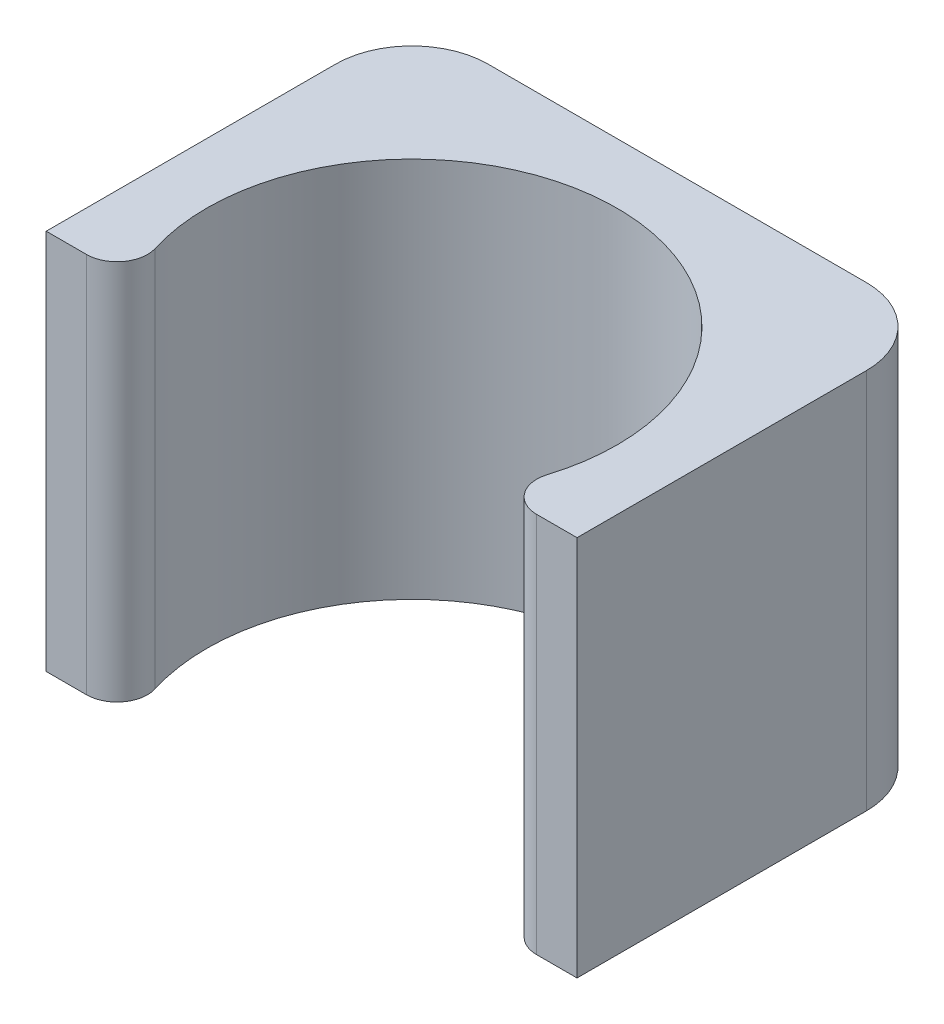
ISO-10303-21;
HEADER;
FILE_DESCRIPTION(('STEP AP214'),'2;1');
FILE_NAME('part.step','',(''),(''),'','','');
FILE_SCHEMA(('AUTOMOTIVE_DESIGN { 1 0 10303 214 1 1 1 1 }'));
ENDSEC;
DATA;
#1=APPLICATION_CONTEXT('core data for automotive mechanical design processes');
#2=APPLICATION_PROTOCOL_DEFINITION('international standard','automotive_design',2000,#1);
#3=PRODUCT_CONTEXT('',#1,'mechanical');
#4=PRODUCT('Part','Part','',(#3));
#5=PRODUCT_RELATED_PRODUCT_CATEGORY('part','',(#4));
#6=PRODUCT_DEFINITION_FORMATION('','',#4);
#7=PRODUCT_DEFINITION_CONTEXT('part definition',#1,'design');
#8=PRODUCT_DEFINITION('design','',#6,#7);
#9=PRODUCT_DEFINITION_SHAPE('','',#8);
#10=(LENGTH_UNIT() NAMED_UNIT(*) SI_UNIT(.MILLI.,.METRE.));
#11=(NAMED_UNIT(*) PLANE_ANGLE_UNIT() SI_UNIT($,.RADIAN.));
#12=(NAMED_UNIT(*) SI_UNIT($,.STERADIAN.) SOLID_ANGLE_UNIT());
#13=UNCERTAINTY_MEASURE_WITH_UNIT(LENGTH_MEASURE(1.E-05),#10,'distance_accuracy_value','');
#14=(GEOMETRIC_REPRESENTATION_CONTEXT(3) GLOBAL_UNCERTAINTY_ASSIGNED_CONTEXT((#13)) GLOBAL_UNIT_ASSIGNED_CONTEXT((#10,
#11,#12)) REPRESENTATION_CONTEXT('',''));
#15=CARTESIAN_POINT('',(0.,0.,0.));
#16=DIRECTION('',(0.,0.,1.));
#17=DIRECTION('',(1.,0.,0.));
#18=AXIS2_PLACEMENT_3D('',#15,#16,#17);
#19=CARTESIAN_POINT('',(-34.8,25.,0.));
#20=DIRECTION('',(0.,0.,1.));
#21=DIRECTION('',(1.,0.,0.));
#22=AXIS2_PLACEMENT_3D('',#19,#20,#21);
#23=PLANE('',#22);
#24=DIRECTION('',(-1.,0.,0.));
#25=VECTOR('',#24,1.);
#26=CARTESIAN_POINT('',(-34.8,25.,0.));
#27=LINE('',#26,#25);
#28=CARTESIAN_POINT('',(-5.,25.,0.));
#29=VERTEX_POINT('',#28);
#30=CARTESIAN_POINT('',(-29.8,25.,0.));
#31=VERTEX_POINT('',#30);
#32=EDGE_CURVE('E118',#29,#31,#27,.T.);
#33=ORIENTED_EDGE('',*,*,#32,.F.);
#34=DIRECTION('',(0.,-1.,0.));
#35=VECTOR('',#34,1.);
#36=CARTESIAN_POINT('',(-5.,25.,0.));
#37=LINE('',#36,#35);
#38=CARTESIAN_POINT('',(-5.,0.,0.));
#39=VERTEX_POINT('',#38);
#40=EDGE_CURVE('E176',#29,#39,#37,.T.);
#41=ORIENTED_EDGE('',*,*,#40,.T.);
#42=DIRECTION('',(-1.,0.,0.));
#43=VECTOR('',#42,1.);
#44=CARTESIAN_POINT('',(-34.8,0.,0.));
#45=LINE('',#44,#43);
#46=CARTESIAN_POINT('',(-29.8,0.,0.));
#47=VERTEX_POINT('',#46);
#48=EDGE_CURVE('E147',#39,#47,#45,.T.);
#49=ORIENTED_EDGE('',*,*,#48,.T.);
#50=DIRECTION('',(0.,-1.,0.));
#51=VECTOR('',#50,1.);
#52=CARTESIAN_POINT('',(-29.8,25.,0.));
#53=LINE('',#52,#51);
#54=EDGE_CURVE('E127',#47,#31,#53,.F.);
#55=ORIENTED_EDGE('',*,*,#54,.T.);
#56=EDGE_LOOP('',(#33,#41,#49,#55));
#57=FACE_BOUND('',#56,.T.);
#58=ADVANCED_FACE('F33',(#57),#23,.F.);
#59=CARTESIAN_POINT('',(-34.8,25.,0.));
#60=DIRECTION('',(1.,0.,0.));
#61=DIRECTION('',(0.,0.,-1.));
#62=AXIS2_PLACEMENT_3D('',#59,#60,#61);
#63=PLANE('',#62);
#64=DIRECTION('',(0.,0.,1.));
#65=VECTOR('',#64,1.);
#66=CARTESIAN_POINT('',(-34.8,25.,0.));
#67=LINE('',#66,#65);
#68=CARTESIAN_POINT('',(-34.8,25.,5.));
#69=VERTEX_POINT('',#68);
#70=CARTESIAN_POINT('',(-34.8,25.,23.97));
#71=VERTEX_POINT('',#70);
#72=EDGE_CURVE('E110',#69,#71,#67,.T.);
#73=ORIENTED_EDGE('',*,*,#72,.F.);
#74=DIRECTION('',(0.,-1.,0.));
#75=VECTOR('',#74,1.);
#76=CARTESIAN_POINT('',(-34.8,25.,5.));
#77=LINE('',#76,#75);
#78=CARTESIAN_POINT('',(-34.8,0.,5.));
#79=VERTEX_POINT('',#78);
#80=EDGE_CURVE('E11',#69,#79,#77,.T.);
#81=ORIENTED_EDGE('',*,*,#80,.T.);
#82=DIRECTION('',(0.,0.,1.));
#83=VECTOR('',#82,1.);
#84=CARTESIAN_POINT('',(-34.8,0.,0.));
#85=LINE('',#84,#83);
#86=CARTESIAN_POINT('',(-34.8,0.,23.97));
#87=VERTEX_POINT('',#86);
#88=EDGE_CURVE('E124',#79,#87,#85,.T.);
#89=ORIENTED_EDGE('',*,*,#88,.T.);
#90=DIRECTION('',(0.,-1.,0.));
#91=VECTOR('',#90,1.);
#92=CARTESIAN_POINT('',(-34.8,25.,23.97));
#93=LINE('',#92,#91);
#94=EDGE_CURVE('E121',#71,#87,#93,.T.);
#95=ORIENTED_EDGE('',*,*,#94,.F.);
#96=EDGE_LOOP('',(#73,#81,#89,#95));
#97=FACE_BOUND('',#96,.T.);
#98=ADVANCED_FACE('F122',(#97),#63,.F.);
#99=CARTESIAN_POINT('',(-34.8,25.,23.97));
#100=DIRECTION('',(0.,0.,-1.));
#101=DIRECTION('',(-1.,0.,0.));
#102=AXIS2_PLACEMENT_3D('',#99,#100,#101);
#103=PLANE('',#102);
#104=DIRECTION('',(1.,0.,0.));
#105=VECTOR('',#104,1.);
#106=CARTESIAN_POINT('',(-34.8,0.,23.97));
#107=LINE('',#106,#105);
#108=CARTESIAN_POINT('',(-32.1586449242469,0.,23.97));
#109=VERTEX_POINT('',#108);
#110=EDGE_CURVE('E151',#87,#109,#107,.T.);
#111=ORIENTED_EDGE('',*,*,#110,.T.);
#112=DIRECTION('',(0.,-1.,0.));
#113=VECTOR('',#112,1.);
#114=CARTESIAN_POINT('',(-32.1586449242469,25.,23.97));
#115=LINE('',#114,#113);
#116=CARTESIAN_POINT('',(-32.1586449242469,25.,23.97));
#117=VERTEX_POINT('',#116);
#118=EDGE_CURVE('E128',#117,#109,#115,.T.);
#119=ORIENTED_EDGE('',*,*,#118,.F.);
#120=DIRECTION('',(1.,0.,0.));
#121=VECTOR('',#120,1.);
#122=CARTESIAN_POINT('',(-34.8,25.,23.97));
#123=LINE('',#122,#121);
#124=EDGE_CURVE('E114',#71,#117,#123,.T.);
#125=ORIENTED_EDGE('',*,*,#124,.F.);
#126=ORIENTED_EDGE('',*,*,#94,.T.);
#127=EDGE_LOOP('',(#111,#119,#125,#126));
#128=FACE_BOUND('',#127,.T.);
#129=ADVANCED_FACE('F130',(#128),#103,.F.);
#130=CARTESIAN_POINT('',(-32.1586449242469,25.,21.97));
#131=DIRECTION('',(0.,-1.,0.));
#132=DIRECTION('',(0.,0.,-1.));
#133=AXIS2_PLACEMENT_3D('',#130,#131,#132);
#134=CYLINDRICAL_SURFACE('',#133,2.);
#135=CARTESIAN_POINT('',(-32.1586449242469,0.,21.97));
#136=DIRECTION('',(0.,1.,0.));
#137=DIRECTION('',(0.,0.,1.));
#138=AXIS2_PLACEMENT_3D('',#135,#136,#137);
#139=CIRCLE('',#138,2.);
#140=CARTESIAN_POINT('',(-30.2481407269334,0.,21.3784142394822));
#141=VERTEX_POINT('',#140);
#142=EDGE_CURVE('E153',#109,#141,#139,.T.);
#143=ORIENTED_EDGE('',*,*,#142,.T.);
#144=DIRECTION('',(0.,-1.,0.));
#145=VECTOR('',#144,1.);
#146=CARTESIAN_POINT('',(-30.2481407269334,25.,21.3784142394822));
#147=LINE('',#146,#145);
#148=CARTESIAN_POINT('',(-30.2481407269334,25.,21.3784142394822));
#149=VERTEX_POINT('',#148);
#150=EDGE_CURVE('E171',#149,#141,#147,.T.);
#151=ORIENTED_EDGE('',*,*,#150,.F.);
#152=CARTESIAN_POINT('',(-32.1586449242469,25.,21.97));
#153=DIRECTION('',(0.,1.,0.));
#154=DIRECTION('',(0.,0.,1.));
#155=AXIS2_PLACEMENT_3D('',#152,#153,#154);
#156=CIRCLE('',#155,2.);
#157=EDGE_CURVE('E133',#117,#149,#156,.T.);
#158=ORIENTED_EDGE('',*,*,#157,.F.);
#159=ORIENTED_EDGE('',*,*,#118,.T.);
#160=EDGE_LOOP('',(#143,#151,#158,#159));
#161=FACE_BOUND('',#160,.T.);
#162=ADVANCED_FACE('F214',(#161),#134,.T.);
#163=CARTESIAN_POINT('',(-17.4,25.,17.4));
#164=DIRECTION('',(0.,-1.,0.));
#165=DIRECTION('',(0.,0.,-1.));
#166=AXIS2_PLACEMENT_3D('',#163,#164,#165);
#167=CYLINDRICAL_SURFACE('',#166,13.45);
#168=CARTESIAN_POINT('',(-17.4,0.,17.4));
#169=DIRECTION('',(0.,-1.,0.));
#170=DIRECTION('',(0.,0.,-1.));
#171=AXIS2_PLACEMENT_3D('',#168,#169,#170);
#172=CIRCLE('',#171,13.45);
#173=CARTESIAN_POINT('',(-4.55185927306658,0.,21.3784142394822));
#174=VERTEX_POINT('',#173);
#175=EDGE_CURVE('E155',#141,#174,#172,.T.);
#176=ORIENTED_EDGE('',*,*,#175,.T.);
#177=DIRECTION('',(0.,-1.,0.));
#178=VECTOR('',#177,1.);
#179=CARTESIAN_POINT('',(-4.55185927306658,25.,21.3784142394822));
#180=LINE('',#179,#178);
#181=CARTESIAN_POINT('',(-4.55185927306658,25.,21.3784142394822));
#182=VERTEX_POINT('',#181);
#183=EDGE_CURVE('E168',#182,#174,#180,.T.);
#184=ORIENTED_EDGE('',*,*,#183,.F.);
#185=CARTESIAN_POINT('',(-17.4,25.,17.4));
#186=DIRECTION('',(0.,-1.,0.));
#187=DIRECTION('',(0.,0.,-1.));
#188=AXIS2_PLACEMENT_3D('',#185,#186,#187);
#189=CIRCLE('',#188,13.45);
#190=EDGE_CURVE('E135',#149,#182,#189,.T.);
#191=ORIENTED_EDGE('',*,*,#190,.F.);
#192=ORIENTED_EDGE('',*,*,#150,.T.);
#193=EDGE_LOOP('',(#176,#184,#191,#192));
#194=FACE_BOUND('',#193,.T.);
#195=ADVANCED_FACE('F211',(#194),#167,.F.);
#196=CARTESIAN_POINT('',(-2.64135507575306,25.,21.97));
#197=DIRECTION('',(0.,-1.,0.));
#198=DIRECTION('',(0.,0.,-1.));
#199=AXIS2_PLACEMENT_3D('',#196,#197,#198);
#200=CYLINDRICAL_SURFACE('',#199,2.);
#201=CARTESIAN_POINT('',(-2.64135507575306,0.,21.97));
#202=DIRECTION('',(0.,1.,0.));
#203=DIRECTION('',(0.,0.,1.));
#204=AXIS2_PLACEMENT_3D('',#201,#202,#203);
#205=CIRCLE('',#204,2.);
#206=CARTESIAN_POINT('',(-2.64135507575306,0.,23.97));
#207=VERTEX_POINT('',#206);
#208=EDGE_CURVE('E157',#174,#207,#205,.T.);
#209=ORIENTED_EDGE('',*,*,#208,.T.);
#210=DIRECTION('',(0.,-1.,0.));
#211=VECTOR('',#210,1.);
#212=CARTESIAN_POINT('',(-2.64135507575306,25.,23.97));
#213=LINE('',#212,#211);
#214=CARTESIAN_POINT('',(-2.64135507575306,25.,23.97));
#215=VERTEX_POINT('',#214);
#216=EDGE_CURVE('E165',#215,#207,#213,.T.);
#217=ORIENTED_EDGE('',*,*,#216,.F.);
#218=CARTESIAN_POINT('',(-2.64135507575306,25.,21.97));
#219=DIRECTION('',(0.,1.,0.));
#220=DIRECTION('',(0.,0.,1.));
#221=AXIS2_PLACEMENT_3D('',#218,#219,#220);
#222=CIRCLE('',#221,2.);
#223=EDGE_CURVE('E140',#182,#215,#222,.T.);
#224=ORIENTED_EDGE('',*,*,#223,.F.);
#225=ORIENTED_EDGE('',*,*,#183,.T.);
#226=EDGE_LOOP('',(#209,#217,#224,#225));
#227=FACE_BOUND('',#226,.T.);
#228=ADVANCED_FACE('F206',(#227),#200,.T.);
#229=CARTESIAN_POINT('',(-2.64135507575306,25.,23.97));
#230=DIRECTION('',(0.,0.,-1.));
#231=DIRECTION('',(-1.,0.,0.));
#232=AXIS2_PLACEMENT_3D('',#229,#230,#231);
#233=PLANE('',#232);
#234=DIRECTION('',(1.,0.,0.));
#235=VECTOR('',#234,1.);
#236=CARTESIAN_POINT('',(-2.64135507575306,0.,23.97));
#237=LINE('',#236,#235);
#238=CARTESIAN_POINT('',(0.,0.,23.97));
#239=VERTEX_POINT('',#238);
#240=EDGE_CURVE('E159',#207,#239,#237,.T.);
#241=ORIENTED_EDGE('',*,*,#240,.T.);
#242=DIRECTION('',(0.,-1.,0.));
#243=VECTOR('',#242,1.);
#244=CARTESIAN_POINT('',(0.,25.,23.97));
#245=LINE('',#244,#243);
#246=CARTESIAN_POINT('',(0.,25.,23.97));
#247=VERTEX_POINT('',#246);
#248=EDGE_CURVE('E146',#247,#239,#245,.T.);
#249=ORIENTED_EDGE('',*,*,#248,.F.);
#250=DIRECTION('',(1.,0.,0.));
#251=VECTOR('',#250,1.);
#252=CARTESIAN_POINT('',(-2.64135507575306,25.,23.97));
#253=LINE('',#252,#251);
#254=EDGE_CURVE('E142',#215,#247,#253,.T.);
#255=ORIENTED_EDGE('',*,*,#254,.F.);
#256=ORIENTED_EDGE('',*,*,#216,.T.);
#257=EDGE_LOOP('',(#241,#249,#255,#256));
#258=FACE_BOUND('',#257,.T.);
#259=ADVANCED_FACE('F200',(#258),#233,.F.);
#260=CARTESIAN_POINT('',(0.,25.,23.97));
#261=DIRECTION('',(-1.,0.,0.));
#262=DIRECTION('',(0.,0.,1.));
#263=AXIS2_PLACEMENT_3D('',#260,#261,#262);
#264=PLANE('',#263);
#265=DIRECTION('',(0.,0.,-1.));
#266=VECTOR('',#265,1.);
#267=CARTESIAN_POINT('',(0.,0.,23.97));
#268=LINE('',#267,#266);
#269=CARTESIAN_POINT('',(0.,0.,5.));
#270=VERTEX_POINT('',#269);
#271=EDGE_CURVE('E161',#239,#270,#268,.T.);
#272=ORIENTED_EDGE('',*,*,#271,.T.);
#273=DIRECTION('',(0.,-1.,0.));
#274=VECTOR('',#273,1.);
#275=CARTESIAN_POINT('',(0.,25.,5.));
#276=LINE('',#275,#274);
#277=CARTESIAN_POINT('',(0.,25.,5.));
#278=VERTEX_POINT('',#277);
#279=EDGE_CURVE('E56',#270,#278,#276,.F.);
#280=ORIENTED_EDGE('',*,*,#279,.T.);
#281=DIRECTION('',(0.,0.,-1.));
#282=VECTOR('',#281,1.);
#283=CARTESIAN_POINT('',(0.,25.,23.97));
#284=LINE('',#283,#282);
#285=EDGE_CURVE('E144',#247,#278,#284,.T.);
#286=ORIENTED_EDGE('',*,*,#285,.F.);
#287=ORIENTED_EDGE('',*,*,#248,.T.);
#288=EDGE_LOOP('',(#272,#280,#286,#287));
#289=FACE_BOUND('',#288,.T.);
#290=ADVANCED_FACE('F196',(#289),#264,.F.);
#291=CARTESIAN_POINT('',(-2.64135507575306,25.,21.97));
#292=DIRECTION('',(0.,1.,0.));
#293=DIRECTION('',(0.,0.,1.));
#294=AXIS2_PLACEMENT_3D('',#291,#292,#293);
#295=PLANE('',#294);
#296=ORIENTED_EDGE('',*,*,#285,.T.);
#297=CARTESIAN_POINT('',(-5.,25.,5.));
#298=DIRECTION('',(0.,1.,0.));
#299=DIRECTION('',(0.,0.,1.));
#300=AXIS2_PLACEMENT_3D('',#297,#298,#299);
#301=CIRCLE('',#300,5.);
#302=EDGE_CURVE('E41',#278,#29,#301,.T.);
#303=ORIENTED_EDGE('',*,*,#302,.T.);
#304=ORIENTED_EDGE('',*,*,#32,.T.);
#305=CARTESIAN_POINT('',(-29.8,25.,5.));
#306=DIRECTION('',(0.,1.,0.));
#307=DIRECTION('',(0.,0.,1.));
#308=AXIS2_PLACEMENT_3D('',#305,#306,#307);
#309=CIRCLE('',#308,5.);
#310=EDGE_CURVE('E48',#31,#69,#309,.T.);
#311=ORIENTED_EDGE('',*,*,#310,.T.);
#312=ORIENTED_EDGE('',*,*,#72,.T.);
#313=ORIENTED_EDGE('',*,*,#124,.T.);
#314=ORIENTED_EDGE('',*,*,#157,.T.);
#315=ORIENTED_EDGE('',*,*,#190,.T.);
#316=ORIENTED_EDGE('',*,*,#223,.T.);
#317=ORIENTED_EDGE('',*,*,#254,.T.);
#318=EDGE_LOOP('',(#296,#303,#304,#311,#312,#313,#314,#315,#316,#317));
#319=FACE_BOUND('',#318,.T.);
#320=ADVANCED_FACE('F112',(#319),#295,.T.);
#321=CARTESIAN_POINT('',(-2.64135507575306,0.,21.97));
#322=DIRECTION('',(0.,1.,0.));
#323=DIRECTION('',(0.,0.,1.));
#324=AXIS2_PLACEMENT_3D('',#321,#322,#323);
#325=PLANE('',#324);
#326=ORIENTED_EDGE('',*,*,#48,.F.);
#327=CARTESIAN_POINT('',(-5.,0.,5.));
#328=DIRECTION('',(0.,1.,0.));
#329=DIRECTION('',(0.,0.,1.));
#330=AXIS2_PLACEMENT_3D('',#327,#328,#329);
#331=CIRCLE('',#330,5.);
#332=EDGE_CURVE('E181',#39,#270,#331,.F.);
#333=ORIENTED_EDGE('',*,*,#332,.T.);
#334=ORIENTED_EDGE('',*,*,#271,.F.);
#335=ORIENTED_EDGE('',*,*,#240,.F.);
#336=ORIENTED_EDGE('',*,*,#208,.F.);
#337=ORIENTED_EDGE('',*,*,#175,.F.);
#338=ORIENTED_EDGE('',*,*,#142,.F.);
#339=ORIENTED_EDGE('',*,*,#110,.F.);
#340=ORIENTED_EDGE('',*,*,#88,.F.);
#341=CARTESIAN_POINT('',(-29.8,0.,5.));
#342=DIRECTION('',(0.,1.,0.));
#343=DIRECTION('',(0.,0.,1.));
#344=AXIS2_PLACEMENT_3D('',#341,#342,#343);
#345=CIRCLE('',#344,5.);
#346=EDGE_CURVE('E179',#79,#47,#345,.F.);
#347=ORIENTED_EDGE('',*,*,#346,.T.);
#348=EDGE_LOOP('',(#326,#333,#334,#335,#336,#337,#338,#339,#340,#347));
#349=FACE_BOUND('',#348,.T.);
#350=ADVANCED_FACE('F194',(#349),#325,.F.);
#351=CARTESIAN_POINT('',(-5.,25.,5.));
#352=DIRECTION('',(0.,-1.,0.));
#353=DIRECTION('',(0.,0.,-1.));
#354=AXIS2_PLACEMENT_3D('',#351,#352,#353);
#355=CYLINDRICAL_SURFACE('',#354,5.);
#356=ORIENTED_EDGE('',*,*,#302,.F.);
#357=ORIENTED_EDGE('',*,*,#279,.F.);
#358=ORIENTED_EDGE('',*,*,#332,.F.);
#359=ORIENTED_EDGE('',*,*,#40,.F.);
#360=EDGE_LOOP('',(#356,#357,#358,#359));
#361=FACE_BOUND('',#360,.T.);
#362=ADVANCED_FACE('F191',(#361),#355,.T.);
#363=CARTESIAN_POINT('',(-29.8,25.,5.));
#364=DIRECTION('',(0.,-1.,0.));
#365=DIRECTION('',(0.,0.,-1.));
#366=AXIS2_PLACEMENT_3D('',#363,#364,#365);
#367=CYLINDRICAL_SURFACE('',#366,5.);
#368=ORIENTED_EDGE('',*,*,#310,.F.);
#369=ORIENTED_EDGE('',*,*,#54,.F.);
#370=ORIENTED_EDGE('',*,*,#346,.F.);
#371=ORIENTED_EDGE('',*,*,#80,.F.);
#372=EDGE_LOOP('',(#368,#369,#370,#371));
#373=FACE_BOUND('',#372,.T.);
#374=ADVANCED_FACE('F35',(#373),#367,.T.);
#375=CLOSED_SHELL('',(#58,#98,#129,#162,#195,#228,#259,#290,#320,#350,#362,#374));
#376=MANIFOLD_SOLID_BREP('B2',#375);
#377=ADVANCED_BREP_SHAPE_REPRESENTATION('',(#18,#376),#14);
#378=SHAPE_DEFINITION_REPRESENTATION(#9,#377);
ENDSEC;
END-ISO-10303-21;
